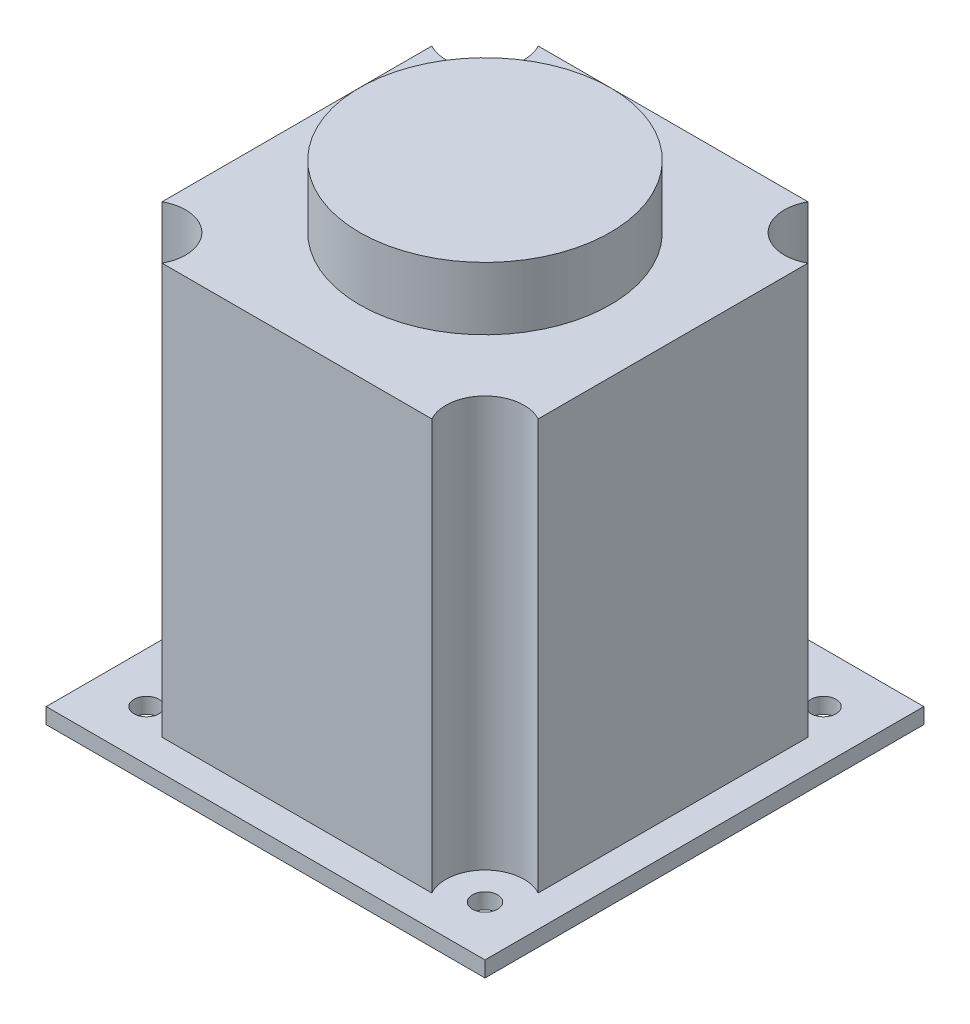
ISO-10303-21;
HEADER;
FILE_DESCRIPTION(('STEP AP214'),'2;1');
FILE_NAME('part.step','',(''),(''),'','','');
FILE_SCHEMA(('AUTOMOTIVE_DESIGN { 1 0 10303 214 1 1 1 1 }'));
ENDSEC;
DATA;
#1=APPLICATION_CONTEXT('core data for automotive mechanical design processes');
#2=APPLICATION_PROTOCOL_DEFINITION('international standard','automotive_design',2000,#1);
#3=PRODUCT_CONTEXT('',#1,'mechanical');
#4=PRODUCT('Part','Part','',(#3));
#5=PRODUCT_RELATED_PRODUCT_CATEGORY('part','',(#4));
#6=PRODUCT_DEFINITION_FORMATION('','',#4);
#7=PRODUCT_DEFINITION_CONTEXT('part definition',#1,'design');
#8=PRODUCT_DEFINITION('design','',#6,#7);
#9=PRODUCT_DEFINITION_SHAPE('','',#8);
#10=(LENGTH_UNIT() NAMED_UNIT(*) SI_UNIT(.MILLI.,.METRE.));
#11=(NAMED_UNIT(*) PLANE_ANGLE_UNIT() SI_UNIT($,.RADIAN.));
#12=(NAMED_UNIT(*) SI_UNIT($,.STERADIAN.) SOLID_ANGLE_UNIT());
#13=UNCERTAINTY_MEASURE_WITH_UNIT(LENGTH_MEASURE(1.E-05),#10,'distance_accuracy_value','');
#14=(GEOMETRIC_REPRESENTATION_CONTEXT(3) GLOBAL_UNCERTAINTY_ASSIGNED_CONTEXT((#13)) GLOBAL_UNIT_ASSIGNED_CONTEXT((#10,
#11,#12)) REPRESENTATION_CONTEXT('',''));
#15=CARTESIAN_POINT('',(0.,0.,0.));
#16=DIRECTION('',(0.,0.,1.));
#17=DIRECTION('',(1.,0.,0.));
#18=AXIS2_PLACEMENT_3D('',#15,#16,#17);
#19=CARTESIAN_POINT('',(0.,5.,0.));
#20=DIRECTION('',(0.,-1.,0.));
#21=DIRECTION('',(0.,0.,-1.));
#22=AXIS2_PLACEMENT_3D('',#19,#20,#21);
#23=PLANE('',#22);
#24=DIRECTION('',(0.,0.,-1.));
#25=VECTOR('',#24,1.);
#26=CARTESIAN_POINT('',(70.,5.,70.));
#27=LINE('',#26,#25);
#28=CARTESIAN_POINT('',(70.,5.,70.));
#29=VERTEX_POINT('',#28);
#30=CARTESIAN_POINT('',(70.,5.,-70.));
#31=VERTEX_POINT('',#30);
#32=EDGE_CURVE('E187',#29,#31,#27,.T.);
#33=ORIENTED_EDGE('',*,*,#32,.T.);
#34=DIRECTION('',(-1.,0.,0.));
#35=VECTOR('',#34,1.);
#36=CARTESIAN_POINT('',(-70.,5.,-70.));
#37=LINE('',#36,#35);
#38=CARTESIAN_POINT('',(-70.,5.,-70.));
#39=VERTEX_POINT('',#38);
#40=EDGE_CURVE('E190',#31,#39,#37,.T.);
#41=ORIENTED_EDGE('',*,*,#40,.T.);
#42=DIRECTION('',(0.,0.,1.));
#43=VECTOR('',#42,1.);
#44=CARTESIAN_POINT('',(-70.,5.,70.));
#45=LINE('',#44,#43);
#46=CARTESIAN_POINT('',(-70.,5.,70.));
#47=VERTEX_POINT('',#46);
#48=EDGE_CURVE('E193',#39,#47,#45,.T.);
#49=ORIENTED_EDGE('',*,*,#48,.T.);
#50=DIRECTION('',(1.,0.,0.));
#51=VECTOR('',#50,1.);
#52=CARTESIAN_POINT('',(-70.,5.,70.));
#53=LINE('',#52,#51);
#54=EDGE_CURVE('E195',#47,#29,#53,.T.);
#55=ORIENTED_EDGE('',*,*,#54,.T.);
#56=EDGE_LOOP('',(#33,#41,#49,#55));
#57=FACE_BOUND('',#56,.T.);
#58=CARTESIAN_POINT('',(-54.,5.,-54.));
#59=DIRECTION('',(0.,1.,0.));
#60=DIRECTION('',(0.,0.,1.));
#61=AXIS2_PLACEMENT_3D('',#58,#59,#60);
#62=CIRCLE('',#61,4.00000000000001);
#63=CARTESIAN_POINT('',(-54.,5.,-50.));
#64=VERTEX_POINT('',#63);
#65=EDGE_CURVE('E166',#64,#64,#62,.T.);
#66=ORIENTED_EDGE('',*,*,#65,.F.);
#67=EDGE_LOOP('',(#66));
#68=FACE_BOUND('',#67,.T.);
#69=CARTESIAN_POINT('',(54.,5.,-54.));
#70=DIRECTION('',(0.,1.,0.));
#71=DIRECTION('',(0.,0.,1.));
#72=AXIS2_PLACEMENT_3D('',#69,#70,#71);
#73=CIRCLE('',#72,4.);
#74=CARTESIAN_POINT('',(54.,5.,-50.));
#75=VERTEX_POINT('',#74);
#76=EDGE_CURVE('E167',#75,#75,#73,.T.);
#77=ORIENTED_EDGE('',*,*,#76,.F.);
#78=EDGE_LOOP('',(#77));
#79=FACE_BOUND('',#78,.T.);
#80=CARTESIAN_POINT('',(54.,5.,54.));
#81=DIRECTION('',(0.,1.,0.));
#82=DIRECTION('',(0.,0.,1.));
#83=AXIS2_PLACEMENT_3D('',#80,#81,#82);
#84=CIRCLE('',#83,4.);
#85=CARTESIAN_POINT('',(54.,5.,58.));
#86=VERTEX_POINT('',#85);
#87=EDGE_CURVE('E173',#86,#86,#84,.T.);
#88=ORIENTED_EDGE('',*,*,#87,.F.);
#89=EDGE_LOOP('',(#88));
#90=FACE_BOUND('',#89,.T.);
#91=CARTESIAN_POINT('',(-54.,5.,54.));
#92=DIRECTION('',(0.,1.,0.));
#93=DIRECTION('',(0.,0.,1.));
#94=AXIS2_PLACEMENT_3D('',#91,#92,#93);
#95=CIRCLE('',#94,4.00000000000001);
#96=CARTESIAN_POINT('',(-54.,5.,58.));
#97=VERTEX_POINT('',#96);
#98=EDGE_CURVE('E157',#97,#97,#95,.T.);
#99=ORIENTED_EDGE('',*,*,#98,.F.);
#100=EDGE_LOOP('',(#99));
#101=FACE_BOUND('',#100,.T.);
#102=CARTESIAN_POINT('',(54.,5.,-54.));
#103=DIRECTION('',(0.,-1.,0.));
#104=DIRECTION('',(0.,0.,1.));
#105=AXIS2_PLACEMENT_3D('',#102,#103,#104);
#106=CIRCLE('',#105,12.5);
#107=CARTESIAN_POINT('',(60.,5.,-43.0341439002693));
#108=VERTEX_POINT('',#107);
#109=CARTESIAN_POINT('',(43.0341439002693,5.,-60.));
#110=VERTEX_POINT('',#109);
#111=EDGE_CURVE('E153',#108,#110,#106,.T.);
#112=ORIENTED_EDGE('',*,*,#111,.F.);
#113=DIRECTION('',(0.,0.,-1.));
#114=VECTOR('',#113,1.);
#115=CARTESIAN_POINT('',(60.,5.,43.0341439002693));
#116=LINE('',#115,#114);
#117=CARTESIAN_POINT('',(60.,5.,43.0341439002693));
#118=VERTEX_POINT('',#117);
#119=EDGE_CURVE('E150',#118,#108,#116,.T.);
#120=ORIENTED_EDGE('',*,*,#119,.F.);
#121=CARTESIAN_POINT('',(54.,5.,54.));
#122=DIRECTION('',(0.,-1.,0.));
#123=DIRECTION('',(0.,0.,1.));
#124=AXIS2_PLACEMENT_3D('',#121,#122,#123);
#125=CIRCLE('',#124,12.5);
#126=CARTESIAN_POINT('',(43.0341439002693,5.,60.));
#127=VERTEX_POINT('',#126);
#128=EDGE_CURVE('E271',#127,#118,#125,.T.);
#129=ORIENTED_EDGE('',*,*,#128,.F.);
#130=DIRECTION('',(1.,0.,0.));
#131=VECTOR('',#130,1.);
#132=CARTESIAN_POINT('',(-43.0341439002693,5.,60.));
#133=LINE('',#132,#131);
#134=CARTESIAN_POINT('',(-43.0341439002693,5.,60.));
#135=VERTEX_POINT('',#134);
#136=EDGE_CURVE('E305',#135,#127,#133,.T.);
#137=ORIENTED_EDGE('',*,*,#136,.F.);
#138=CARTESIAN_POINT('',(-54.,5.,54.));
#139=DIRECTION('',(0.,-1.,0.));
#140=DIRECTION('',(0.,0.,1.));
#141=AXIS2_PLACEMENT_3D('',#138,#139,#140);
#142=CIRCLE('',#141,12.5);
#143=CARTESIAN_POINT('',(-60.,5.,43.0341439002694));
#144=VERTEX_POINT('',#143);
#145=EDGE_CURVE('E299',#144,#135,#142,.T.);
#146=ORIENTED_EDGE('',*,*,#145,.F.);
#147=DIRECTION('',(0.,0.,1.));
#148=VECTOR('',#147,1.);
#149=CARTESIAN_POINT('',(-60.,5.,43.0341439002693));
#150=LINE('',#149,#148);
#151=CARTESIAN_POINT('',(-60.,5.,-43.0341439002693));
#152=VERTEX_POINT('',#151);
#153=EDGE_CURVE('E294',#152,#144,#150,.T.);
#154=ORIENTED_EDGE('',*,*,#153,.F.);
#155=CARTESIAN_POINT('',(-54.,5.,-54.));
#156=DIRECTION('',(0.,-1.,0.));
#157=DIRECTION('',(0.,0.,1.));
#158=AXIS2_PLACEMENT_3D('',#155,#156,#157);
#159=CIRCLE('',#158,12.5);
#160=CARTESIAN_POINT('',(-43.0341439002693,5.,-60.));
#161=VERTEX_POINT('',#160);
#162=EDGE_CURVE('E64',#161,#152,#159,.T.);
#163=ORIENTED_EDGE('',*,*,#162,.F.);
#164=DIRECTION('',(-1.,0.,0.));
#165=VECTOR('',#164,1.);
#166=CARTESIAN_POINT('',(-43.0341439002693,5.,-60.));
#167=LINE('',#166,#165);
#168=EDGE_CURVE('E59',#110,#161,#167,.T.);
#169=ORIENTED_EDGE('',*,*,#168,.F.);
#170=EDGE_LOOP('',(#112,#120,#129,#137,#146,#154,#163,#169));
#171=FACE_BOUND('',#170,.T.);
#172=ADVANCED_FACE('F43',(#57,#68,#79,#90,#101,#171),#23,.F.);
#173=CARTESIAN_POINT('',(70.,5.,70.));
#174=DIRECTION('',(-1.,0.,0.));
#175=DIRECTION('',(0.,0.,1.));
#176=AXIS2_PLACEMENT_3D('',#173,#174,#175);
#177=PLANE('',#176);
#178=DIRECTION('',(0.,0.,-1.));
#179=VECTOR('',#178,1.);
#180=CARTESIAN_POINT('',(70.,0.,70.));
#181=LINE('',#180,#179);
#182=CARTESIAN_POINT('',(70.,0.,70.));
#183=VERTEX_POINT('',#182);
#184=CARTESIAN_POINT('',(70.,0.,-70.));
#185=VERTEX_POINT('',#184);
#186=EDGE_CURVE('E184',#183,#185,#181,.T.);
#187=ORIENTED_EDGE('',*,*,#186,.T.);
#188=DIRECTION('',(0.,-1.,0.));
#189=VECTOR('',#188,1.);
#190=CARTESIAN_POINT('',(70.,5.,-70.));
#191=LINE('',#190,#189);
#192=EDGE_CURVE('E212',#31,#185,#191,.T.);
#193=ORIENTED_EDGE('',*,*,#192,.F.);
#194=ORIENTED_EDGE('',*,*,#32,.F.);
#195=DIRECTION('',(0.,-1.,0.));
#196=VECTOR('',#195,1.);
#197=CARTESIAN_POINT('',(70.,5.,70.));
#198=LINE('',#197,#196);
#199=EDGE_CURVE('E197',#29,#183,#198,.T.);
#200=ORIENTED_EDGE('',*,*,#199,.T.);
#201=EDGE_LOOP('',(#187,#193,#194,#200));
#202=FACE_BOUND('',#201,.T.);
#203=ADVANCED_FACE('F45',(#202),#177,.F.);
#204=CARTESIAN_POINT('',(-70.,5.,-70.));
#205=DIRECTION('',(0.,0.,1.));
#206=DIRECTION('',(1.,0.,0.));
#207=AXIS2_PLACEMENT_3D('',#204,#205,#206);
#208=PLANE('',#207);
#209=DIRECTION('',(-1.,0.,0.));
#210=VECTOR('',#209,1.);
#211=CARTESIAN_POINT('',(-70.,0.,-70.));
#212=LINE('',#211,#210);
#213=CARTESIAN_POINT('',(-70.,0.,-70.));
#214=VERTEX_POINT('',#213);
#215=EDGE_CURVE('E200',#185,#214,#212,.T.);
#216=ORIENTED_EDGE('',*,*,#215,.T.);
#217=DIRECTION('',(0.,-1.,0.));
#218=VECTOR('',#217,1.);
#219=CARTESIAN_POINT('',(-70.,5.,-70.));
#220=LINE('',#219,#218);
#221=EDGE_CURVE('E210',#39,#214,#220,.T.);
#222=ORIENTED_EDGE('',*,*,#221,.F.);
#223=ORIENTED_EDGE('',*,*,#40,.F.);
#224=ORIENTED_EDGE('',*,*,#192,.T.);
#225=EDGE_LOOP('',(#216,#222,#223,#224));
#226=FACE_BOUND('',#225,.T.);
#227=ADVANCED_FACE('F249',(#226),#208,.F.);
#228=CARTESIAN_POINT('',(-70.,5.,70.));
#229=DIRECTION('',(1.,0.,0.));
#230=DIRECTION('',(0.,0.,-1.));
#231=AXIS2_PLACEMENT_3D('',#228,#229,#230);
#232=PLANE('',#231);
#233=DIRECTION('',(0.,0.,1.));
#234=VECTOR('',#233,1.);
#235=CARTESIAN_POINT('',(-70.,0.,70.));
#236=LINE('',#235,#234);
#237=CARTESIAN_POINT('',(-70.,0.,70.));
#238=VERTEX_POINT('',#237);
#239=EDGE_CURVE('E202',#214,#238,#236,.T.);
#240=ORIENTED_EDGE('',*,*,#239,.T.);
#241=DIRECTION('',(0.,-1.,0.));
#242=VECTOR('',#241,1.);
#243=CARTESIAN_POINT('',(-70.,5.,70.));
#244=LINE('',#243,#242);
#245=EDGE_CURVE('E207',#47,#238,#244,.T.);
#246=ORIENTED_EDGE('',*,*,#245,.F.);
#247=ORIENTED_EDGE('',*,*,#48,.F.);
#248=ORIENTED_EDGE('',*,*,#221,.T.);
#249=EDGE_LOOP('',(#240,#246,#247,#248));
#250=FACE_BOUND('',#249,.T.);
#251=ADVANCED_FACE('F247',(#250),#232,.F.);
#252=CARTESIAN_POINT('',(-70.,5.,70.));
#253=DIRECTION('',(0.,0.,-1.));
#254=DIRECTION('',(-1.,0.,0.));
#255=AXIS2_PLACEMENT_3D('',#252,#253,#254);
#256=PLANE('',#255);
#257=DIRECTION('',(1.,0.,0.));
#258=VECTOR('',#257,1.);
#259=CARTESIAN_POINT('',(-70.,0.,70.));
#260=LINE('',#259,#258);
#261=EDGE_CURVE('E191',#238,#183,#260,.T.);
#262=ORIENTED_EDGE('',*,*,#261,.T.);
#263=ORIENTED_EDGE('',*,*,#199,.F.);
#264=ORIENTED_EDGE('',*,*,#54,.F.);
#265=ORIENTED_EDGE('',*,*,#245,.T.);
#266=EDGE_LOOP('',(#262,#263,#264,#265));
#267=FACE_BOUND('',#266,.T.);
#268=ADVANCED_FACE('F226',(#267),#256,.F.);
#269=CARTESIAN_POINT('',(0.,0.,0.));
#270=DIRECTION('',(0.,-1.,0.));
#271=DIRECTION('',(0.,0.,-1.));
#272=AXIS2_PLACEMENT_3D('',#269,#270,#271);
#273=PLANE('',#272);
#274=CARTESIAN_POINT('',(0.,0.,0.));
#275=DIRECTION('',(0.,-1.,0.));
#276=DIRECTION('',(0.,0.,-1.));
#277=AXIS2_PLACEMENT_3D('',#274,#275,#276);
#278=CIRCLE('',#277,7.5);
#279=CARTESIAN_POINT('',(0.,0.,-7.5));
#280=VERTEX_POINT('',#279);
#281=EDGE_CURVE('E47',#280,#280,#278,.T.);
#282=ORIENTED_EDGE('',*,*,#281,.F.);
#283=EDGE_LOOP('',(#282));
#284=FACE_BOUND('',#283,.T.);
#285=CARTESIAN_POINT('',(-54.,0.,54.));
#286=DIRECTION('',(0.,1.,0.));
#287=DIRECTION('',(0.,0.,1.));
#288=AXIS2_PLACEMENT_3D('',#285,#286,#287);
#289=CIRCLE('',#288,4.00000000000001);
#290=CARTESIAN_POINT('',(-54.,0.,58.));
#291=VERTEX_POINT('',#290);
#292=EDGE_CURVE('E176',#291,#291,#289,.T.);
#293=ORIENTED_EDGE('',*,*,#292,.T.);
#294=EDGE_LOOP('',(#293));
#295=FACE_BOUND('',#294,.T.);
#296=CARTESIAN_POINT('',(54.,0.,54.));
#297=DIRECTION('',(0.,1.,0.));
#298=DIRECTION('',(0.,0.,1.));
#299=AXIS2_PLACEMENT_3D('',#296,#297,#298);
#300=CIRCLE('',#299,4.);
#301=CARTESIAN_POINT('',(54.,0.,58.));
#302=VERTEX_POINT('',#301);
#303=EDGE_CURVE('E170',#302,#302,#300,.T.);
#304=ORIENTED_EDGE('',*,*,#303,.T.);
#305=EDGE_LOOP('',(#304));
#306=FACE_BOUND('',#305,.T.);
#307=CARTESIAN_POINT('',(54.,0.,-54.));
#308=DIRECTION('',(0.,1.,0.));
#309=DIRECTION('',(0.,0.,1.));
#310=AXIS2_PLACEMENT_3D('',#307,#308,#309);
#311=CIRCLE('',#310,4.);
#312=CARTESIAN_POINT('',(54.,0.,-50.));
#313=VERTEX_POINT('',#312);
#314=EDGE_CURVE('E163',#313,#313,#311,.T.);
#315=ORIENTED_EDGE('',*,*,#314,.T.);
#316=EDGE_LOOP('',(#315));
#317=FACE_BOUND('',#316,.T.);
#318=CARTESIAN_POINT('',(-54.,0.,-54.));
#319=DIRECTION('',(0.,1.,0.));
#320=DIRECTION('',(0.,0.,1.));
#321=AXIS2_PLACEMENT_3D('',#318,#319,#320);
#322=CIRCLE('',#321,4.00000000000001);
#323=CARTESIAN_POINT('',(-54.,0.,-50.));
#324=VERTEX_POINT('',#323);
#325=EDGE_CURVE('E181',#324,#324,#322,.T.);
#326=ORIENTED_EDGE('',*,*,#325,.T.);
#327=EDGE_LOOP('',(#326));
#328=FACE_BOUND('',#327,.T.);
#329=ORIENTED_EDGE('',*,*,#186,.F.);
#330=ORIENTED_EDGE('',*,*,#261,.F.);
#331=ORIENTED_EDGE('',*,*,#239,.F.);
#332=ORIENTED_EDGE('',*,*,#215,.F.);
#333=EDGE_LOOP('',(#329,#330,#331,#332));
#334=FACE_BOUND('',#333,.T.);
#335=ADVANCED_FACE('F222',(#284,#295,#306,#317,#328,#334),#273,.T.);
#336=CARTESIAN_POINT('',(-54.,0.,-54.));
#337=DIRECTION('',(0.,1.,0.));
#338=DIRECTION('',(0.,0.,1.));
#339=AXIS2_PLACEMENT_3D('',#336,#337,#338);
#340=CYLINDRICAL_SURFACE('',#339,4.00000000000001);
#341=ORIENTED_EDGE('',*,*,#325,.F.);
#342=EDGE_LOOP('',(#341));
#343=FACE_BOUND('',#342,.T.);
#344=ORIENTED_EDGE('',*,*,#65,.T.);
#345=EDGE_LOOP('',(#344));
#346=FACE_BOUND('',#345,.T.);
#347=ADVANCED_FACE('F225',(#343,#346),#340,.F.);
#348=CARTESIAN_POINT('',(54.,0.,-54.));
#349=DIRECTION('',(0.,1.,0.));
#350=DIRECTION('',(0.,0.,1.));
#351=AXIS2_PLACEMENT_3D('',#348,#349,#350);
#352=CYLINDRICAL_SURFACE('',#351,4.);
#353=ORIENTED_EDGE('',*,*,#314,.F.);
#354=EDGE_LOOP('',(#353));
#355=FACE_BOUND('',#354,.T.);
#356=ORIENTED_EDGE('',*,*,#76,.T.);
#357=EDGE_LOOP('',(#356));
#358=FACE_BOUND('',#357,.T.);
#359=ADVANCED_FACE('F366',(#355,#358),#352,.F.);
#360=CARTESIAN_POINT('',(54.,0.,54.));
#361=DIRECTION('',(0.,1.,0.));
#362=DIRECTION('',(0.,0.,1.));
#363=AXIS2_PLACEMENT_3D('',#360,#361,#362);
#364=CYLINDRICAL_SURFACE('',#363,4.);
#365=ORIENTED_EDGE('',*,*,#303,.F.);
#366=EDGE_LOOP('',(#365));
#367=FACE_BOUND('',#366,.T.);
#368=ORIENTED_EDGE('',*,*,#87,.T.);
#369=EDGE_LOOP('',(#368));
#370=FACE_BOUND('',#369,.T.);
#371=ADVANCED_FACE('F369',(#367,#370),#364,.F.);
#372=CARTESIAN_POINT('',(-54.,0.,54.));
#373=DIRECTION('',(0.,1.,0.));
#374=DIRECTION('',(0.,0.,1.));
#375=AXIS2_PLACEMENT_3D('',#372,#373,#374);
#376=CYLINDRICAL_SURFACE('',#375,4.00000000000001);
#377=ORIENTED_EDGE('',*,*,#292,.F.);
#378=EDGE_LOOP('',(#377));
#379=FACE_BOUND('',#378,.T.);
#380=ORIENTED_EDGE('',*,*,#98,.T.);
#381=EDGE_LOOP('',(#380));
#382=FACE_BOUND('',#381,.T.);
#383=ADVANCED_FACE('F365',(#379,#382),#376,.F.);
#384=CARTESIAN_POINT('',(0.,-11.,0.));
#385=DIRECTION('',(0.,1.,0.));
#386=DIRECTION('',(0.,0.,1.));
#387=AXIS2_PLACEMENT_3D('',#384,#385,#386);
#388=CYLINDRICAL_SURFACE('',#387,7.5);
#389=ORIENTED_EDGE('',*,*,#281,.T.);
#390=EDGE_LOOP('',(#389));
#391=FACE_BOUND('',#390,.T.);
#392=CARTESIAN_POINT('',(0.,-11.,0.));
#393=DIRECTION('',(0.,1.,0.));
#394=DIRECTION('',(0.,0.,1.));
#395=AXIS2_PLACEMENT_3D('',#392,#393,#394);
#396=CIRCLE('',#395,7.5);
#397=CARTESIAN_POINT('',(0.,-11.,7.5));
#398=VERTEX_POINT('',#397);
#399=EDGE_CURVE('E154',#398,#398,#396,.T.);
#400=ORIENTED_EDGE('',*,*,#399,.T.);
#401=EDGE_LOOP('',(#400));
#402=FACE_BOUND('',#401,.T.);
#403=ADVANCED_FACE('F219',(#391,#402),#388,.T.);
#404=CARTESIAN_POINT('',(0.,-11.,0.));
#405=DIRECTION('',(0.,1.,0.));
#406=DIRECTION('',(0.,0.,1.));
#407=AXIS2_PLACEMENT_3D('',#404,#405,#406);
#408=PLANE('',#407);
#409=ORIENTED_EDGE('',*,*,#399,.F.);
#410=EDGE_LOOP('',(#409));
#411=FACE_BOUND('',#410,.T.);
#412=ADVANCED_FACE('F359',(#411),#408,.F.);
#413=CARTESIAN_POINT('',(54.,136.000000000003,-54.));
#414=DIRECTION('',(0.,-1.,0.));
#415=DIRECTION('',(0.,0.,-1.));
#416=AXIS2_PLACEMENT_3D('',#413,#414,#415);
#417=CYLINDRICAL_SURFACE('',#416,12.5);
#418=ORIENTED_EDGE('',*,*,#111,.T.);
#419=DIRECTION('',(0.,-1.,0.));
#420=VECTOR('',#419,1.);
#421=CARTESIAN_POINT('',(43.0341439002693,136.000000000003,-60.));
#422=LINE('',#421,#420);
#423=CARTESIAN_POINT('',(43.0341439002693,136.000000000003,-60.));
#424=VERTEX_POINT('',#423);
#425=EDGE_CURVE('E134',#424,#110,#422,.T.);
#426=ORIENTED_EDGE('',*,*,#425,.F.);
#427=CARTESIAN_POINT('',(54.,136.000000000003,-54.));
#428=DIRECTION('',(0.,-1.,0.));
#429=DIRECTION('',(0.,0.,1.));
#430=AXIS2_PLACEMENT_3D('',#427,#428,#429);
#431=CIRCLE('',#430,12.5);
#432=CARTESIAN_POINT('',(60.,136.000000000003,-43.0341439002693));
#433=VERTEX_POINT('',#432);
#434=EDGE_CURVE('E141',#433,#424,#431,.T.);
#435=ORIENTED_EDGE('',*,*,#434,.F.);
#436=DIRECTION('',(0.,-1.,0.));
#437=VECTOR('',#436,1.);
#438=CARTESIAN_POINT('',(60.,136.000000000003,-43.0341439002693));
#439=LINE('',#438,#437);
#440=EDGE_CURVE('E268',#433,#108,#439,.T.);
#441=ORIENTED_EDGE('',*,*,#440,.T.);
#442=EDGE_LOOP('',(#418,#426,#435,#441));
#443=FACE_BOUND('',#442,.T.);
#444=ADVANCED_FACE('F152',(#443),#417,.F.);
#445=CARTESIAN_POINT('',(-43.0341439002693,136.000000000003,-60.));
#446=DIRECTION('',(0.,0.,1.));
#447=DIRECTION('',(1.,0.,0.));
#448=AXIS2_PLACEMENT_3D('',#445,#446,#447);
#449=PLANE('',#448);
#450=ORIENTED_EDGE('',*,*,#168,.T.);
#451=DIRECTION('',(0.,-1.,0.));
#452=VECTOR('',#451,1.);
#453=CARTESIAN_POINT('',(-43.0341439002693,136.000000000003,-60.));
#454=LINE('',#453,#452);
#455=CARTESIAN_POINT('',(-43.0341439002693,136.000000000003,-60.));
#456=VERTEX_POINT('',#455);
#457=EDGE_CURVE('E137',#456,#161,#454,.T.);
#458=ORIENTED_EDGE('',*,*,#457,.F.);
#459=DIRECTION('',(-1.,0.,0.));
#460=VECTOR('',#459,1.);
#461=CARTESIAN_POINT('',(-43.0341439002693,136.000000000003,-60.));
#462=LINE('',#461,#460);
#463=EDGE_CURVE('E130',#424,#456,#462,.T.);
#464=ORIENTED_EDGE('',*,*,#463,.F.);
#465=ORIENTED_EDGE('',*,*,#425,.T.);
#466=EDGE_LOOP('',(#450,#458,#464,#465));
#467=FACE_BOUND('',#466,.T.);
#468=ADVANCED_FACE('F132',(#467),#449,.F.);
#469=CARTESIAN_POINT('',(-54.,136.000000000003,-54.));
#470=DIRECTION('',(0.,-1.,0.));
#471=DIRECTION('',(0.,0.,-1.));
#472=AXIS2_PLACEMENT_3D('',#469,#470,#471);
#473=CYLINDRICAL_SURFACE('',#472,12.5);
#474=ORIENTED_EDGE('',*,*,#162,.T.);
#475=DIRECTION('',(0.,-1.,0.));
#476=VECTOR('',#475,1.);
#477=CARTESIAN_POINT('',(-60.,136.000000000003,-43.0341439002693));
#478=LINE('',#477,#476);
#479=CARTESIAN_POINT('',(-60.,136.000000000003,-43.0341439002693));
#480=VERTEX_POINT('',#479);
#481=EDGE_CURVE('E159',#480,#152,#478,.T.);
#482=ORIENTED_EDGE('',*,*,#481,.F.);
#483=CARTESIAN_POINT('',(-54.,136.000000000003,-54.));
#484=DIRECTION('',(0.,-1.,0.));
#485=DIRECTION('',(0.,0.,1.));
#486=AXIS2_PLACEMENT_3D('',#483,#484,#485);
#487=CIRCLE('',#486,12.5);
#488=EDGE_CURVE('E140',#456,#480,#487,.T.);
#489=ORIENTED_EDGE('',*,*,#488,.F.);
#490=ORIENTED_EDGE('',*,*,#457,.T.);
#491=EDGE_LOOP('',(#474,#482,#489,#490));
#492=FACE_BOUND('',#491,.T.);
#493=ADVANCED_FACE('F297',(#492),#473,.F.);
#494=CARTESIAN_POINT('',(-60.,136.000000000003,43.0341439002693));
#495=DIRECTION('',(1.,0.,0.));
#496=DIRECTION('',(0.,0.,-1.));
#497=AXIS2_PLACEMENT_3D('',#494,#495,#496);
#498=PLANE('',#497);
#499=ORIENTED_EDGE('',*,*,#153,.T.);
#500=DIRECTION('',(0.,-1.,0.));
#501=VECTOR('',#500,1.);
#502=CARTESIAN_POINT('',(-60.,136.000000000003,43.0341439002694));
#503=LINE('',#502,#501);
#504=CARTESIAN_POINT('',(-60.,136.000000000003,43.0341439002694));
#505=VERTEX_POINT('',#504);
#506=EDGE_CURVE('E285',#505,#144,#503,.T.);
#507=ORIENTED_EDGE('',*,*,#506,.F.);
#508=DIRECTION('',(0.,0.,1.));
#509=VECTOR('',#508,1.);
#510=CARTESIAN_POINT('',(-60.,136.000000000003,43.0341439002693));
#511=LINE('',#510,#509);
#512=EDGE_CURVE('E295',#480,#505,#511,.T.);
#513=ORIENTED_EDGE('',*,*,#512,.F.);
#514=ORIENTED_EDGE('',*,*,#481,.T.);
#515=EDGE_LOOP('',(#499,#507,#513,#514));
#516=FACE_BOUND('',#515,.T.);
#517=ADVANCED_FACE('F292',(#516),#498,.F.);
#518=CARTESIAN_POINT('',(-54.,136.000000000003,54.));
#519=DIRECTION('',(0.,-1.,0.));
#520=DIRECTION('',(0.,0.,-1.));
#521=AXIS2_PLACEMENT_3D('',#518,#519,#520);
#522=CYLINDRICAL_SURFACE('',#521,12.5);
#523=ORIENTED_EDGE('',*,*,#145,.T.);
#524=DIRECTION('',(0.,-1.,0.));
#525=VECTOR('',#524,1.);
#526=CARTESIAN_POINT('',(-43.0341439002693,136.000000000003,60.));
#527=LINE('',#526,#525);
#528=CARTESIAN_POINT('',(-43.0341439002693,136.000000000003,60.));
#529=VERTEX_POINT('',#528);
#530=EDGE_CURVE('E282',#529,#135,#527,.T.);
#531=ORIENTED_EDGE('',*,*,#530,.F.);
#532=CARTESIAN_POINT('',(-54.,136.000000000003,54.));
#533=DIRECTION('',(0.,-1.,0.));
#534=DIRECTION('',(0.,0.,1.));
#535=AXIS2_PLACEMENT_3D('',#532,#533,#534);
#536=CIRCLE('',#535,12.5);
#537=EDGE_CURVE('E319',#505,#529,#536,.T.);
#538=ORIENTED_EDGE('',*,*,#537,.F.);
#539=ORIENTED_EDGE('',*,*,#506,.T.);
#540=EDGE_LOOP('',(#523,#531,#538,#539));
#541=FACE_BOUND('',#540,.T.);
#542=ADVANCED_FACE('F318',(#541),#522,.F.);
#543=CARTESIAN_POINT('',(-43.0341439002693,136.000000000003,60.));
#544=DIRECTION('',(0.,0.,-1.));
#545=DIRECTION('',(-1.,0.,0.));
#546=AXIS2_PLACEMENT_3D('',#543,#544,#545);
#547=PLANE('',#546);
#548=ORIENTED_EDGE('',*,*,#136,.T.);
#549=DIRECTION('',(0.,-1.,0.));
#550=VECTOR('',#549,1.);
#551=CARTESIAN_POINT('',(43.0341439002693,136.000000000003,60.));
#552=LINE('',#551,#550);
#553=CARTESIAN_POINT('',(43.0341439002693,136.000000000003,60.));
#554=VERTEX_POINT('',#553);
#555=EDGE_CURVE('E274',#554,#127,#552,.T.);
#556=ORIENTED_EDGE('',*,*,#555,.F.);
#557=DIRECTION('',(1.,0.,0.));
#558=VECTOR('',#557,1.);
#559=CARTESIAN_POINT('',(-43.0341439002693,136.000000000003,60.));
#560=LINE('',#559,#558);
#561=EDGE_CURVE('E315',#529,#554,#560,.T.);
#562=ORIENTED_EDGE('',*,*,#561,.F.);
#563=ORIENTED_EDGE('',*,*,#530,.T.);
#564=EDGE_LOOP('',(#548,#556,#562,#563));
#565=FACE_BOUND('',#564,.T.);
#566=ADVANCED_FACE('F312',(#565),#547,.F.);
#567=CARTESIAN_POINT('',(54.,136.000000000003,54.));
#568=DIRECTION('',(0.,-1.,0.));
#569=DIRECTION('',(0.,0.,-1.));
#570=AXIS2_PLACEMENT_3D('',#567,#568,#569);
#571=CYLINDRICAL_SURFACE('',#570,12.5);
#572=ORIENTED_EDGE('',*,*,#128,.T.);
#573=DIRECTION('',(0.,-1.,0.));
#574=VECTOR('',#573,1.);
#575=CARTESIAN_POINT('',(60.,136.000000000003,43.0341439002693));
#576=LINE('',#575,#574);
#577=CARTESIAN_POINT('',(60.,136.000000000003,43.0341439002693));
#578=VERTEX_POINT('',#577);
#579=EDGE_CURVE('E270',#578,#118,#576,.T.);
#580=ORIENTED_EDGE('',*,*,#579,.F.);
#581=CARTESIAN_POINT('',(54.,136.000000000003,54.));
#582=DIRECTION('',(0.,-1.,0.));
#583=DIRECTION('',(0.,0.,1.));
#584=AXIS2_PLACEMENT_3D('',#581,#582,#583);
#585=CIRCLE('',#584,12.5);
#586=EDGE_CURVE('E276',#554,#578,#585,.T.);
#587=ORIENTED_EDGE('',*,*,#586,.F.);
#588=ORIENTED_EDGE('',*,*,#555,.T.);
#589=EDGE_LOOP('',(#572,#580,#587,#588));
#590=FACE_BOUND('',#589,.T.);
#591=ADVANCED_FACE('F308',(#590),#571,.F.);
#592=CARTESIAN_POINT('',(60.,136.000000000003,43.0341439002693));
#593=DIRECTION('',(-1.,0.,0.));
#594=DIRECTION('',(0.,0.,1.));
#595=AXIS2_PLACEMENT_3D('',#592,#593,#594);
#596=PLANE('',#595);
#597=ORIENTED_EDGE('',*,*,#119,.T.);
#598=ORIENTED_EDGE('',*,*,#440,.F.);
#599=DIRECTION('',(0.,0.,-1.));
#600=VECTOR('',#599,1.);
#601=CARTESIAN_POINT('',(60.,136.000000000003,43.0341439002693));
#602=LINE('',#601,#600);
#603=EDGE_CURVE('E146',#578,#433,#602,.T.);
#604=ORIENTED_EDGE('',*,*,#603,.F.);
#605=ORIENTED_EDGE('',*,*,#579,.T.);
#606=EDGE_LOOP('',(#597,#598,#604,#605));
#607=FACE_BOUND('',#606,.T.);
#608=ADVANCED_FACE('F267',(#607),#596,.F.);
#609=CARTESIAN_POINT('',(54.,136.000000000003,-54.));
#610=DIRECTION('',(0.,1.,0.));
#611=DIRECTION('',(0.,0.,1.));
#612=AXIS2_PLACEMENT_3D('',#609,#610,#611);
#613=PLANE('',#612);
#614=CARTESIAN_POINT('',(0.,136.000000000003,0.));
#615=DIRECTION('',(0.,1.,0.));
#616=DIRECTION('',(0.,0.,1.));
#617=AXIS2_PLACEMENT_3D('',#614,#615,#616);
#618=CIRCLE('',#617,40.);
#619=CARTESIAN_POINT('',(0.,136.000000000003,40.));
#620=VERTEX_POINT('',#619);
#621=EDGE_CURVE('E11',#620,#620,#618,.T.);
#622=ORIENTED_EDGE('',*,*,#621,.F.);
#623=EDGE_LOOP('',(#622));
#624=FACE_BOUND('',#623,.T.);
#625=ORIENTED_EDGE('',*,*,#434,.T.);
#626=ORIENTED_EDGE('',*,*,#463,.T.);
#627=ORIENTED_EDGE('',*,*,#488,.T.);
#628=ORIENTED_EDGE('',*,*,#512,.T.);
#629=ORIENTED_EDGE('',*,*,#537,.T.);
#630=ORIENTED_EDGE('',*,*,#561,.T.);
#631=ORIENTED_EDGE('',*,*,#586,.T.);
#632=ORIENTED_EDGE('',*,*,#603,.T.);
#633=EDGE_LOOP('',(#625,#626,#627,#628,#629,#630,#631,#632));
#634=FACE_BOUND('',#633,.T.);
#635=ADVANCED_FACE('F144',(#624,#634),#613,.T.);
#636=CARTESIAN_POINT('',(0.,156.000000000003,0.));
#637=DIRECTION('',(0.,-1.,0.));
#638=DIRECTION('',(0.,0.,-1.));
#639=AXIS2_PLACEMENT_3D('',#636,#637,#638);
#640=CYLINDRICAL_SURFACE('',#639,40.);
#641=CARTESIAN_POINT('',(0.,156.000000000003,0.));
#642=DIRECTION('',(0.,1.,0.));
#643=DIRECTION('',(0.,0.,1.));
#644=AXIS2_PLACEMENT_3D('',#641,#642,#643);
#645=CIRCLE('',#644,40.);
#646=CARTESIAN_POINT('',(0.,156.000000000003,40.));
#647=VERTEX_POINT('',#646);
#648=EDGE_CURVE('E263',#647,#647,#645,.T.);
#649=ORIENTED_EDGE('',*,*,#648,.F.);
#650=EDGE_LOOP('',(#649));
#651=FACE_BOUND('',#650,.T.);
#652=ORIENTED_EDGE('',*,*,#621,.T.);
#653=EDGE_LOOP('',(#652));
#654=FACE_BOUND('',#653,.T.);
#655=ADVANCED_FACE('F331',(#651,#654),#640,.T.);
#656=CARTESIAN_POINT('',(0.,156.000000000003,0.));
#657=DIRECTION('',(0.,1.,0.));
#658=DIRECTION('',(0.,0.,1.));
#659=AXIS2_PLACEMENT_3D('',#656,#657,#658);
#660=PLANE('',#659);
#661=ORIENTED_EDGE('',*,*,#648,.T.);
#662=EDGE_LOOP('',(#661));
#663=FACE_BOUND('',#662,.T.);
#664=ADVANCED_FACE('F329',(#663),#660,.T.);
#665=CLOSED_SHELL('',(#172,#203,#227,#251,#268,#335,#347,#359,#371,#383,#403,#412,#444,#468,
#493,#517,#542,#566,#591,#608,#635,#655,#664));
#666=MANIFOLD_SOLID_BREP('B2',#665);
#667=ADVANCED_BREP_SHAPE_REPRESENTATION('',(#18,#666),#14);
#668=SHAPE_DEFINITION_REPRESENTATION(#9,#667);
ENDSEC;
END-ISO-10303-21;
